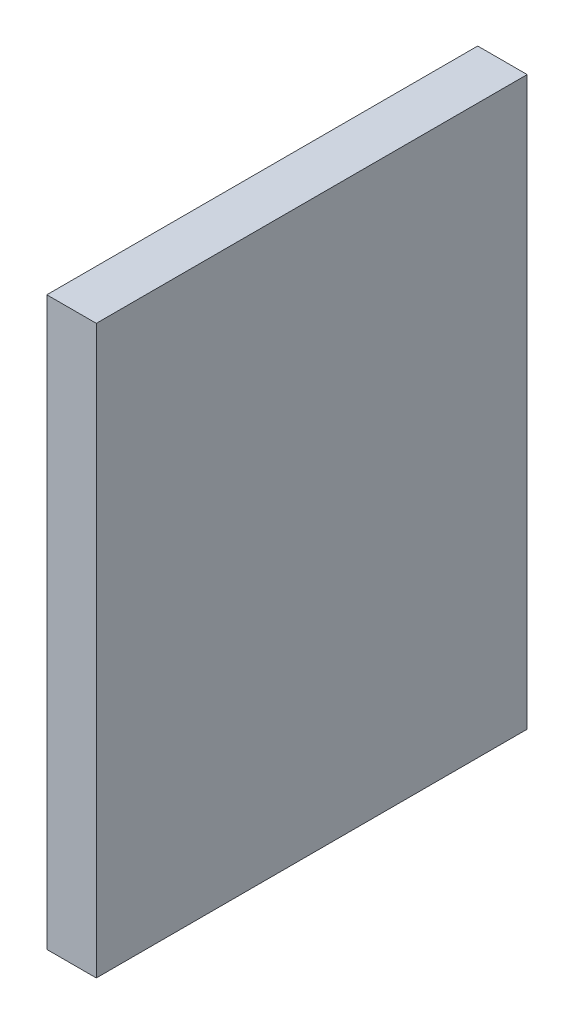
ISO-10303-21;
HEADER;
FILE_DESCRIPTION(('STEP AP214'),'2;1');
FILE_NAME('part.step','',(''),(''),'','','');
FILE_SCHEMA(('AUTOMOTIVE_DESIGN { 1 0 10303 214 1 1 1 1 }'));
ENDSEC;
DATA;
#1=APPLICATION_CONTEXT('core data for automotive mechanical design processes');
#2=APPLICATION_PROTOCOL_DEFINITION('international standard','automotive_design',2000,#1);
#3=PRODUCT_CONTEXT('',#1,'mechanical');
#4=PRODUCT('Part','Part','',(#3));
#5=PRODUCT_RELATED_PRODUCT_CATEGORY('part','',(#4));
#6=PRODUCT_DEFINITION_FORMATION('','',#4);
#7=PRODUCT_DEFINITION_CONTEXT('part definition',#1,'design');
#8=PRODUCT_DEFINITION('design','',#6,#7);
#9=PRODUCT_DEFINITION_SHAPE('','',#8);
#10=(LENGTH_UNIT() NAMED_UNIT(*) SI_UNIT(.MILLI.,.METRE.));
#11=(NAMED_UNIT(*) PLANE_ANGLE_UNIT() SI_UNIT($,.RADIAN.));
#12=(NAMED_UNIT(*) SI_UNIT($,.STERADIAN.) SOLID_ANGLE_UNIT());
#13=UNCERTAINTY_MEASURE_WITH_UNIT(LENGTH_MEASURE(1.E-05),#10,'distance_accuracy_value','');
#14=(GEOMETRIC_REPRESENTATION_CONTEXT(3) GLOBAL_UNCERTAINTY_ASSIGNED_CONTEXT((#13)) GLOBAL_UNIT_ASSIGNED_CONTEXT((#10,
#11,#12)) REPRESENTATION_CONTEXT('',''));
#15=CARTESIAN_POINT('',(0.,0.,0.));
#16=DIRECTION('',(0.,0.,1.));
#17=DIRECTION('',(1.,0.,0.));
#18=AXIS2_PLACEMENT_3D('',#15,#16,#17);
#19=CARTESIAN_POINT('',(-125.,-75.,114.));
#20=DIRECTION('',(1.,0.,0.));
#21=DIRECTION('',(0.,0.,-1.));
#22=AXIS2_PLACEMENT_3D('',#19,#20,#21);
#23=PLANE('',#22);
#24=DIRECTION('',(0.,-1.,0.));
#25=VECTOR('',#24,1.);
#26=CARTESIAN_POINT('',(-125.,-75.,0.));
#27=LINE('',#26,#25);
#28=CARTESIAN_POINT('',(-125.,75.,0.));
#29=VERTEX_POINT('',#28);
#30=CARTESIAN_POINT('',(-125.,-75.,0.));
#31=VERTEX_POINT('',#30);
#32=EDGE_CURVE('E70',#29,#31,#27,.T.);
#33=ORIENTED_EDGE('',*,*,#32,.T.);
#34=DIRECTION('',(0.,0.,-1.));
#35=VECTOR('',#34,1.);
#36=CARTESIAN_POINT('',(-125.,-75.,114.));
#37=LINE('',#36,#35);
#38=CARTESIAN_POINT('',(-125.,-75.,114.));
#39=VERTEX_POINT('',#38);
#40=EDGE_CURVE('E72',#39,#31,#37,.T.);
#41=ORIENTED_EDGE('',*,*,#40,.F.);
#42=DIRECTION('',(0.,-1.,0.));
#43=VECTOR('',#42,1.);
#44=CARTESIAN_POINT('',(-125.,-75.,114.));
#45=LINE('',#44,#43);
#46=CARTESIAN_POINT('',(-125.,75.,114.));
#47=VERTEX_POINT('',#46);
#48=EDGE_CURVE('E57',#47,#39,#45,.T.);
#49=ORIENTED_EDGE('',*,*,#48,.F.);
#50=DIRECTION('',(0.,0.,-1.));
#51=VECTOR('',#50,1.);
#52=CARTESIAN_POINT('',(-125.,75.,114.));
#53=LINE('',#52,#51);
#54=EDGE_CURVE('E42',#47,#29,#53,.T.);
#55=ORIENTED_EDGE('',*,*,#54,.T.);
#56=EDGE_LOOP('',(#33,#41,#49,#55));
#57=FACE_BOUND('',#56,.T.);
#58=ADVANCED_FACE('F34',(#57),#23,.F.);
#59=CARTESIAN_POINT('',(0.,0.,114.));
#60=DIRECTION('',(0.,0.,-1.));
#61=DIRECTION('',(-1.,0.,0.));
#62=AXIS2_PLACEMENT_3D('',#59,#60,#61);
#63=PLANE('',#62);
#64=DIRECTION('',(1.,0.,0.));
#65=VECTOR('',#64,1.);
#66=CARTESIAN_POINT('',(-125.,-75.,114.));
#67=LINE('',#66,#65);
#68=CARTESIAN_POINT('',(-111.910976648008,-75.,114.));
#69=VERTEX_POINT('',#68);
#70=EDGE_CURVE('E86',#39,#69,#67,.T.);
#71=ORIENTED_EDGE('',*,*,#70,.T.);
#72=DIRECTION('',(0.,1.,0.));
#73=VECTOR('',#72,1.);
#74=CARTESIAN_POINT('',(-111.910976648008,0.,114.));
#75=LINE('',#74,#73);
#76=CARTESIAN_POINT('',(-111.910976648008,75.,114.));
#77=VERTEX_POINT('',#76);
#78=EDGE_CURVE('E11',#69,#77,#75,.T.);
#79=ORIENTED_EDGE('',*,*,#78,.T.);
#80=DIRECTION('',(-1.,0.,0.));
#81=VECTOR('',#80,1.);
#82=CARTESIAN_POINT('',(-125.,75.,114.));
#83=LINE('',#82,#81);
#84=EDGE_CURVE('E91',#77,#47,#83,.T.);
#85=ORIENTED_EDGE('',*,*,#84,.T.);
#86=ORIENTED_EDGE('',*,*,#48,.T.);
#87=EDGE_LOOP('',(#71,#79,#85,#86));
#88=FACE_BOUND('',#87,.T.);
#89=ADVANCED_FACE('F108',(#88),#63,.F.);
#90=CARTESIAN_POINT('',(-125.,75.,114.));
#91=DIRECTION('',(0.,-1.,0.));
#92=DIRECTION('',(0.,0.,-1.));
#93=AXIS2_PLACEMENT_3D('',#90,#91,#92);
#94=PLANE('',#93);
#95=ORIENTED_EDGE('',*,*,#84,.F.);
#96=DIRECTION('',(0.,0.,-1.));
#97=VECTOR('',#96,1.);
#98=CARTESIAN_POINT('',(-111.910976648008,75.,-16.0571550711005));
#99=LINE('',#98,#97);
#100=CARTESIAN_POINT('',(-111.910976648008,75.,0.));
#101=VERTEX_POINT('',#100);
#102=EDGE_CURVE('E49',#77,#101,#99,.T.);
#103=ORIENTED_EDGE('',*,*,#102,.T.);
#104=DIRECTION('',(-1.,0.,0.));
#105=VECTOR('',#104,1.);
#106=CARTESIAN_POINT('',(-125.,75.,0.));
#107=LINE('',#106,#105);
#108=EDGE_CURVE('E79',#101,#29,#107,.T.);
#109=ORIENTED_EDGE('',*,*,#108,.T.);
#110=ORIENTED_EDGE('',*,*,#54,.F.);
#111=EDGE_LOOP('',(#95,#103,#109,#110));
#112=FACE_BOUND('',#111,.T.);
#113=ADVANCED_FACE('F36',(#112),#94,.F.);
#114=CARTESIAN_POINT('',(0.,0.,0.));
#115=DIRECTION('',(0.,0.,-1.));
#116=DIRECTION('',(-1.,0.,0.));
#117=AXIS2_PLACEMENT_3D('',#114,#115,#116);
#118=PLANE('',#117);
#119=DIRECTION('',(0.,1.,0.));
#120=VECTOR('',#119,1.);
#121=CARTESIAN_POINT('',(-111.910976648008,0.,0.));
#122=LINE('',#121,#120);
#123=CARTESIAN_POINT('',(-111.910976648008,-75.,0.));
#124=VERTEX_POINT('',#123);
#125=EDGE_CURVE('E90',#124,#101,#122,.T.);
#126=ORIENTED_EDGE('',*,*,#125,.F.);
#127=DIRECTION('',(1.,0.,0.));
#128=VECTOR('',#127,1.);
#129=CARTESIAN_POINT('',(-125.,-75.,0.));
#130=LINE('',#129,#128);
#131=EDGE_CURVE('E78',#31,#124,#130,.T.);
#132=ORIENTED_EDGE('',*,*,#131,.F.);
#133=ORIENTED_EDGE('',*,*,#32,.F.);
#134=ORIENTED_EDGE('',*,*,#108,.F.);
#135=EDGE_LOOP('',(#126,#132,#133,#134));
#136=FACE_BOUND('',#135,.T.);
#137=ADVANCED_FACE('F89',(#136),#118,.T.);
#138=CARTESIAN_POINT('',(-125.,-75.,114.));
#139=DIRECTION('',(0.,1.,0.));
#140=DIRECTION('',(0.,0.,1.));
#141=AXIS2_PLACEMENT_3D('',#138,#139,#140);
#142=PLANE('',#141);
#143=ORIENTED_EDGE('',*,*,#131,.T.);
#144=DIRECTION('',(0.,0.,-1.));
#145=VECTOR('',#144,1.);
#146=CARTESIAN_POINT('',(-111.910976648008,-75.,-16.0571550711005));
#147=LINE('',#146,#145);
#148=EDGE_CURVE('E99',#69,#124,#147,.T.);
#149=ORIENTED_EDGE('',*,*,#148,.F.);
#150=ORIENTED_EDGE('',*,*,#70,.F.);
#151=ORIENTED_EDGE('',*,*,#40,.T.);
#152=EDGE_LOOP('',(#143,#149,#150,#151));
#153=FACE_BOUND('',#152,.T.);
#154=ADVANCED_FACE('F83',(#153),#142,.F.);
#155=CARTESIAN_POINT('',(-111.910976648008,75.,-16.0571550711005));
#156=DIRECTION('',(-1.,0.,0.));
#157=DIRECTION('',(0.,0.,1.));
#158=AXIS2_PLACEMENT_3D('',#155,#156,#157);
#159=PLANE('',#158);
#160=ORIENTED_EDGE('',*,*,#125,.T.);
#161=ORIENTED_EDGE('',*,*,#102,.F.);
#162=ORIENTED_EDGE('',*,*,#78,.F.);
#163=ORIENTED_EDGE('',*,*,#148,.T.);
#164=EDGE_LOOP('',(#160,#161,#162,#163));
#165=FACE_BOUND('',#164,.T.);
#166=ADVANCED_FACE('F107',(#165),#159,.F.);
#167=CLOSED_SHELL('',(#58,#89,#113,#137,#154,#166));
#168=MANIFOLD_SOLID_BREP('B2',#167);
#169=ADVANCED_BREP_SHAPE_REPRESENTATION('',(#18,#168),#14);
#170=SHAPE_DEFINITION_REPRESENTATION(#9,#169);
ENDSEC;
END-ISO-10303-21;
